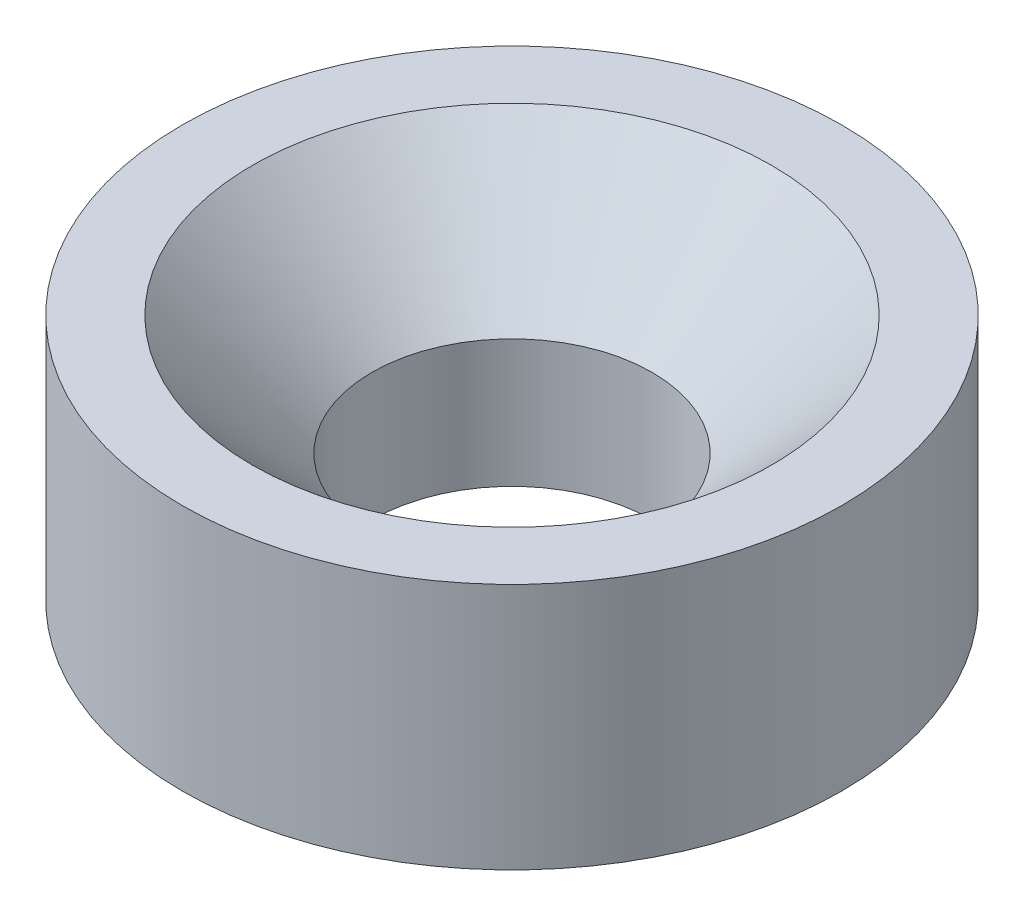
ISO-10303-21;
HEADER;
FILE_DESCRIPTION(('STEP AP214'),'2;1');
FILE_NAME('part.step','',(''),(''),'','','');
FILE_SCHEMA(('AUTOMOTIVE_DESIGN { 1 0 10303 214 1 1 1 1 }'));
ENDSEC;
DATA;
#1=APPLICATION_CONTEXT('core data for automotive mechanical design processes');
#2=APPLICATION_PROTOCOL_DEFINITION('international standard','automotive_design',2000,#1);
#3=PRODUCT_CONTEXT('',#1,'mechanical');
#4=PRODUCT('Part','Part','',(#3));
#5=PRODUCT_RELATED_PRODUCT_CATEGORY('part','',(#4));
#6=PRODUCT_DEFINITION_FORMATION('','',#4);
#7=PRODUCT_DEFINITION_CONTEXT('part definition',#1,'design');
#8=PRODUCT_DEFINITION('design','',#6,#7);
#9=PRODUCT_DEFINITION_SHAPE('','',#8);
#10=(LENGTH_UNIT() NAMED_UNIT(*) SI_UNIT(.MILLI.,.METRE.));
#11=(NAMED_UNIT(*) PLANE_ANGLE_UNIT() SI_UNIT($,.RADIAN.));
#12=(NAMED_UNIT(*) SI_UNIT($,.STERADIAN.) SOLID_ANGLE_UNIT());
#13=UNCERTAINTY_MEASURE_WITH_UNIT(LENGTH_MEASURE(1.E-05),#10,'distance_accuracy_value','');
#14=(GEOMETRIC_REPRESENTATION_CONTEXT(3) GLOBAL_UNCERTAINTY_ASSIGNED_CONTEXT((#13)) GLOBAL_UNIT_ASSIGNED_CONTEXT((#10,
#11,#12)) REPRESENTATION_CONTEXT('',''));
#15=CARTESIAN_POINT('',(0.,0.,0.));
#16=DIRECTION('',(0.,0.,1.));
#17=DIRECTION('',(1.,0.,0.));
#18=AXIS2_PLACEMENT_3D('',#15,#16,#17);
#19=CARTESIAN_POINT('',(0.,3.,0.));
#20=DIRECTION('',(0.,-1.,0.));
#21=DIRECTION('',(0.,0.,-1.));
#22=AXIS2_PLACEMENT_3D('',#19,#20,#21);
#23=CYLINDRICAL_SURFACE('',#22,4.);
#24=CARTESIAN_POINT('',(0.,3.,0.));
#25=DIRECTION('',(0.,1.,0.));
#26=DIRECTION('',(0.,0.,1.));
#27=AXIS2_PLACEMENT_3D('',#24,#25,#26);
#28=CIRCLE('',#27,4.);
#29=CARTESIAN_POINT('',(0.,3.,4.));
#30=VERTEX_POINT('',#29);
#31=EDGE_CURVE('E10',#30,#30,#28,.T.);
#32=ORIENTED_EDGE('',*,*,#31,.F.);
#33=EDGE_LOOP('',(#32));
#34=FACE_BOUND('',#33,.T.);
#35=CARTESIAN_POINT('',(0.,0.,0.));
#36=DIRECTION('',(0.,1.,0.));
#37=DIRECTION('',(0.,0.,1.));
#38=AXIS2_PLACEMENT_3D('',#35,#36,#37);
#39=CIRCLE('',#38,4.);
#40=CARTESIAN_POINT('',(0.,0.,4.));
#41=VERTEX_POINT('',#40);
#42=EDGE_CURVE('E34',#41,#41,#39,.T.);
#43=ORIENTED_EDGE('',*,*,#42,.T.);
#44=EDGE_LOOP('',(#43));
#45=FACE_BOUND('',#44,.T.);
#46=ADVANCED_FACE('F31',(#34,#45),#23,.T.);
#47=CARTESIAN_POINT('',(0.,3.,0.));
#48=DIRECTION('',(0.,1.,0.));
#49=DIRECTION('',(0.,0.,1.));
#50=AXIS2_PLACEMENT_3D('',#47,#48,#49);
#51=PLANE('',#50);
#52=CARTESIAN_POINT('',(0.,3.,0.));
#53=DIRECTION('',(0.,1.,0.));
#54=DIRECTION('',(0.,0.,1.));
#55=AXIS2_PLACEMENT_3D('',#52,#53,#54);
#56=CIRCLE('',#55,3.15);
#57=CARTESIAN_POINT('',(0.,3.,3.15));
#58=VERTEX_POINT('',#57);
#59=EDGE_CURVE('E48',#58,#58,#56,.T.);
#60=ORIENTED_EDGE('',*,*,#59,.F.);
#61=EDGE_LOOP('',(#60));
#62=FACE_BOUND('',#61,.T.);
#63=ORIENTED_EDGE('',*,*,#31,.T.);
#64=EDGE_LOOP('',(#63));
#65=FACE_BOUND('',#64,.T.);
#66=ADVANCED_FACE('F54',(#62,#65),#51,.T.);
#67=CARTESIAN_POINT('',(0.,0.,0.));
#68=DIRECTION('',(0.,1.,0.));
#69=DIRECTION('',(0.,0.,1.));
#70=AXIS2_PLACEMENT_3D('',#67,#68,#69);
#71=PLANE('',#70);
#72=CARTESIAN_POINT('',(0.,0.,0.));
#73=DIRECTION('',(0.,1.,0.));
#74=DIRECTION('',(0.,0.,1.));
#75=AXIS2_PLACEMENT_3D('',#72,#73,#74);
#76=CIRCLE('',#75,1.7);
#77=CARTESIAN_POINT('',(0.,0.,1.7));
#78=VERTEX_POINT('',#77);
#79=EDGE_CURVE('E41',#78,#78,#76,.T.);
#80=ORIENTED_EDGE('',*,*,#79,.T.);
#81=EDGE_LOOP('',(#80));
#82=FACE_BOUND('',#81,.T.);
#83=ORIENTED_EDGE('',*,*,#42,.F.);
#84=EDGE_LOOP('',(#83));
#85=FACE_BOUND('',#84,.T.);
#86=ADVANCED_FACE('F56',(#82,#85),#71,.F.);
#87=CARTESIAN_POINT('',(0.,3.,0.));
#88=DIRECTION('',(0.,1.,0.));
#89=DIRECTION('',(0.,0.,1.));
#90=AXIS2_PLACEMENT_3D('',#87,#88,#89);
#91=CYLINDRICAL_SURFACE('',#90,1.7);
#92=ORIENTED_EDGE('',*,*,#79,.F.);
#93=EDGE_LOOP('',(#92));
#94=FACE_BOUND('',#93,.T.);
#95=CARTESIAN_POINT('',(0.,1.54999999999999,0.));
#96=DIRECTION('',(0.,1.,0.));
#97=DIRECTION('',(0.,0.,1.));
#98=AXIS2_PLACEMENT_3D('',#95,#96,#97);
#99=CIRCLE('',#98,1.69999999999999);
#100=CARTESIAN_POINT('',(0.,1.54999999999999,1.69999999999999));
#101=VERTEX_POINT('',#100);
#102=EDGE_CURVE('E45',#101,#101,#99,.T.);
#103=ORIENTED_EDGE('',*,*,#102,.T.);
#104=EDGE_LOOP('',(#103));
#105=FACE_BOUND('',#104,.T.);
#106=ADVANCED_FACE('F62',(#94,#105),#91,.F.);
#107=CARTESIAN_POINT('',(0.,3.,0.));
#108=DIRECTION('',(0.,1.,0.));
#109=DIRECTION('',(0.,0.,1.));
#110=AXIS2_PLACEMENT_3D('',#107,#108,#109);
#111=CONICAL_SURFACE('',#110,3.15,0.785398163397448);
#112=ORIENTED_EDGE('',*,*,#102,.F.);
#113=EDGE_LOOP('',(#112));
#114=FACE_BOUND('',#113,.T.);
#115=ORIENTED_EDGE('',*,*,#59,.T.);
#116=EDGE_LOOP('',(#115));
#117=FACE_BOUND('',#116,.T.);
#118=ADVANCED_FACE('F52',(#114,#117),#111,.F.);
#119=CLOSED_SHELL('',(#46,#66,#86,#106,#118));
#120=MANIFOLD_SOLID_BREP('B2',#119);
#121=ADVANCED_BREP_SHAPE_REPRESENTATION('',(#18,#120),#14);
#122=SHAPE_DEFINITION_REPRESENTATION(#9,#121);
ENDSEC;
END-ISO-10303-21;
